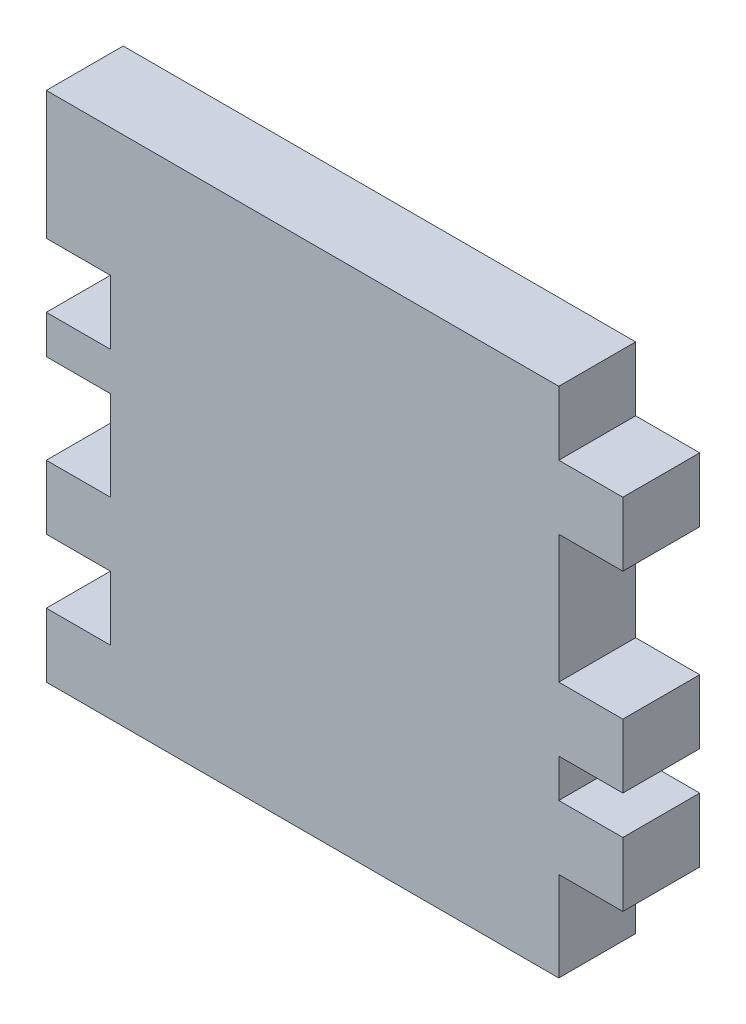
ISO-10303-21;
HEADER;
FILE_DESCRIPTION(('STEP AP214'),'2;1');
FILE_NAME('part.step','',(''),(''),'','','');
FILE_SCHEMA(('AUTOMOTIVE_DESIGN { 1 0 10303 214 1 1 1 1 }'));
ENDSEC;
DATA;
#1=APPLICATION_CONTEXT('core data for automotive mechanical design processes');
#2=APPLICATION_PROTOCOL_DEFINITION('international standard','automotive_design',2000,#1);
#3=PRODUCT_CONTEXT('',#1,'mechanical');
#4=PRODUCT('Part','Part','',(#3));
#5=PRODUCT_RELATED_PRODUCT_CATEGORY('part','',(#4));
#6=PRODUCT_DEFINITION_FORMATION('','',#4);
#7=PRODUCT_DEFINITION_CONTEXT('part definition',#1,'design');
#8=PRODUCT_DEFINITION('design','',#6,#7);
#9=PRODUCT_DEFINITION_SHAPE('','',#8);
#10=(LENGTH_UNIT() NAMED_UNIT(*) SI_UNIT(.MILLI.,.METRE.));
#11=(NAMED_UNIT(*) PLANE_ANGLE_UNIT() SI_UNIT($,.RADIAN.));
#12=(NAMED_UNIT(*) SI_UNIT($,.STERADIAN.) SOLID_ANGLE_UNIT());
#13=UNCERTAINTY_MEASURE_WITH_UNIT(LENGTH_MEASURE(1.E-05),#10,'distance_accuracy_value','');
#14=(GEOMETRIC_REPRESENTATION_CONTEXT(3) GLOBAL_UNCERTAINTY_ASSIGNED_CONTEXT((#13)) GLOBAL_UNIT_ASSIGNED_CONTEXT((#10,
#11,#12)) REPRESENTATION_CONTEXT('',''));
#15=CARTESIAN_POINT('',(0.,0.,0.));
#16=DIRECTION('',(0.,0.,1.));
#17=DIRECTION('',(1.,0.,0.));
#18=AXIS2_PLACEMENT_3D('',#15,#16,#17);
#19=CARTESIAN_POINT('',(23.7388987566607,17.3845470692718,6.));
#20=DIRECTION('',(1.,0.,0.));
#21=DIRECTION('',(0.,1.,0.));
#22=AXIS2_PLACEMENT_3D('',#19,#20,#21);
#23=PLANE('',#22);
#24=DIRECTION('',(0.,-1.,0.));
#25=VECTOR('',#24,1.);
#26=CARTESIAN_POINT('',(23.7388987566607,17.3845470692718,6.));
#27=LINE('',#26,#25);
#28=CARTESIAN_POINT('',(23.7388987566607,-10.6154529307282,6.));
#29=VERTEX_POINT('',#28);
#30=CARTESIAN_POINT('',(23.7388987566607,-15.6154529307282,6.));
#31=VERTEX_POINT('',#30);
#32=EDGE_CURVE('E237',#29,#31,#27,.T.);
#33=ORIENTED_EDGE('',*,*,#32,.T.);
#34=DIRECTION('',(0.,0.,1.));
#35=VECTOR('',#34,1.);
#36=CARTESIAN_POINT('',(23.7388987566607,-15.6154529307282,0.));
#37=LINE('',#36,#35);
#38=CARTESIAN_POINT('',(23.7388987566607,-15.6154529307282,0.));
#39=VERTEX_POINT('',#38);
#40=EDGE_CURVE('E222',#39,#31,#37,.T.);
#41=ORIENTED_EDGE('',*,*,#40,.F.);
#42=DIRECTION('',(0.,-1.,0.));
#43=VECTOR('',#42,1.);
#44=CARTESIAN_POINT('',(23.7388987566607,17.3845470692718,0.));
#45=LINE('',#44,#43);
#46=CARTESIAN_POINT('',(23.7388987566607,-10.6154529307282,0.));
#47=VERTEX_POINT('',#46);
#48=EDGE_CURVE('E235',#47,#39,#45,.T.);
#49=ORIENTED_EDGE('',*,*,#48,.F.);
#50=DIRECTION('',(0.,0.,1.));
#51=VECTOR('',#50,1.);
#52=CARTESIAN_POINT('',(23.7388987566607,-10.6154529307282,0.));
#53=LINE('',#52,#51);
#54=EDGE_CURVE('E391',#47,#29,#53,.T.);
#55=ORIENTED_EDGE('',*,*,#54,.T.);
#56=EDGE_LOOP('',(#33,#41,#49,#55));
#57=FACE_BOUND('',#56,.T.);
#58=ADVANCED_FACE('F33',(#57),#23,.T.);
#59=CARTESIAN_POINT('',(0.,0.,6.));
#60=DIRECTION('',(0.,0.,-1.));
#61=DIRECTION('',(-1.,0.,0.));
#62=AXIS2_PLACEMENT_3D('',#59,#60,#61);
#63=PLANE('',#62);
#64=DIRECTION('',(1.,0.,0.));
#65=VECTOR('',#64,1.);
#66=CARTESIAN_POINT('',(18.7388987566607,-15.6154529307282,6.));
#67=LINE('',#66,#65);
#68=CARTESIAN_POINT('',(18.7388987566607,-15.6154529307282,6.));
#69=VERTEX_POINT('',#68);
#70=EDGE_CURVE('E229',#69,#31,#67,.T.);
#71=ORIENTED_EDGE('',*,*,#70,.T.);
#72=ORIENTED_EDGE('',*,*,#32,.F.);
#73=DIRECTION('',(-1.,0.,0.));
#74=VECTOR('',#73,1.);
#75=CARTESIAN_POINT('',(23.7388987566607,-10.6154529307282,6.));
#76=LINE('',#75,#74);
#77=CARTESIAN_POINT('',(18.7388987566608,-10.6154529307282,6.));
#78=VERTEX_POINT('',#77);
#79=EDGE_CURVE('E392',#29,#78,#76,.T.);
#80=ORIENTED_EDGE('',*,*,#79,.T.);
#81=DIRECTION('',(0.,-1.,0.));
#82=VECTOR('',#81,1.);
#83=CARTESIAN_POINT('',(18.7388987566608,-7.61545293072824,6.));
#84=LINE('',#83,#82);
#85=CARTESIAN_POINT('',(18.7388987566608,-7.61545293072824,6.));
#86=VERTEX_POINT('',#85);
#87=EDGE_CURVE('E396',#86,#78,#84,.T.);
#88=ORIENTED_EDGE('',*,*,#87,.F.);
#89=DIRECTION('',(-1.,0.,0.));
#90=VECTOR('',#89,1.);
#91=CARTESIAN_POINT('',(23.7388987566607,-7.61545293072824,6.));
#92=LINE('',#91,#90);
#93=CARTESIAN_POINT('',(23.7388987566607,-7.61545293072824,6.));
#94=VERTEX_POINT('',#93);
#95=EDGE_CURVE('E385',#94,#86,#92,.T.);
#96=ORIENTED_EDGE('',*,*,#95,.F.);
#97=CARTESIAN_POINT('',(23.7388987566607,-2.61545293072824,6.));
#98=VERTEX_POINT('',#97);
#99=EDGE_CURVE('E296',#98,#94,#27,.T.);
#100=ORIENTED_EDGE('',*,*,#99,.F.);
#101=DIRECTION('',(-1.,0.,0.));
#102=VECTOR('',#101,1.);
#103=CARTESIAN_POINT('',(23.7388987566607,-2.61545293072824,6.));
#104=LINE('',#103,#102);
#105=CARTESIAN_POINT('',(18.7388987566608,-2.61545293072824,6.));
#106=VERTEX_POINT('',#105);
#107=EDGE_CURVE('E414',#98,#106,#104,.T.);
#108=ORIENTED_EDGE('',*,*,#107,.T.);
#109=DIRECTION('',(0.,-1.,0.));
#110=VECTOR('',#109,1.);
#111=CARTESIAN_POINT('',(18.7388987566608,7.38454706927176,6.));
#112=LINE('',#111,#110);
#113=CARTESIAN_POINT('',(18.7388987566608,7.38454706927176,6.));
#114=VERTEX_POINT('',#113);
#115=EDGE_CURVE('E418',#114,#106,#112,.T.);
#116=ORIENTED_EDGE('',*,*,#115,.F.);
#117=DIRECTION('',(-1.,0.,0.));
#118=VECTOR('',#117,1.);
#119=CARTESIAN_POINT('',(23.7388987566607,7.38454706927176,6.));
#120=LINE('',#119,#118);
#121=CARTESIAN_POINT('',(23.7388987566607,7.38454706927176,6.));
#122=VERTEX_POINT('',#121);
#123=EDGE_CURVE('E409',#122,#114,#120,.T.);
#124=ORIENTED_EDGE('',*,*,#123,.F.);
#125=CARTESIAN_POINT('',(23.7388987566607,12.3845470692718,6.));
#126=VERTEX_POINT('',#125);
#127=EDGE_CURVE('E292',#126,#122,#27,.T.);
#128=ORIENTED_EDGE('',*,*,#127,.F.);
#129=DIRECTION('',(-1.,0.,0.));
#130=VECTOR('',#129,1.);
#131=CARTESIAN_POINT('',(23.7388987566607,12.3845470692718,6.));
#132=LINE('',#131,#130);
#133=CARTESIAN_POINT('',(18.7388987566607,12.3845470692718,6.));
#134=VERTEX_POINT('',#133);
#135=EDGE_CURVE('E436',#126,#134,#132,.T.);
#136=ORIENTED_EDGE('',*,*,#135,.T.);
#137=DIRECTION('',(0.,1.,0.));
#138=VECTOR('',#137,1.);
#139=CARTESIAN_POINT('',(18.7388987566607,12.3845470692718,6.));
#140=LINE('',#139,#138);
#141=CARTESIAN_POINT('',(18.7388987566607,17.3845470692718,6.));
#142=VERTEX_POINT('',#141);
#143=EDGE_CURVE('E417',#134,#142,#140,.T.);
#144=ORIENTED_EDGE('',*,*,#143,.T.);
#145=DIRECTION('',(1.,0.,0.));
#146=VECTOR('',#145,1.);
#147=CARTESIAN_POINT('',(-21.2611012433392,17.3845470692718,6.));
#148=LINE('',#147,#146);
#149=CARTESIAN_POINT('',(-21.2611012433392,17.3845470692718,6.));
#150=VERTEX_POINT('',#149);
#151=EDGE_CURVE('E286',#150,#142,#148,.T.);
#152=ORIENTED_EDGE('',*,*,#151,.F.);
#153=DIRECTION('',(0.,-1.,0.));
#154=VECTOR('',#153,1.);
#155=CARTESIAN_POINT('',(-21.2611012433392,17.3845470692718,6.));
#156=LINE('',#155,#154);
#157=CARTESIAN_POINT('',(-21.2611012433392,7.38454706927176,6.));
#158=VERTEX_POINT('',#157);
#159=EDGE_CURVE('E270',#150,#158,#156,.T.);
#160=ORIENTED_EDGE('',*,*,#159,.T.);
#161=DIRECTION('',(1.,0.,0.));
#162=VECTOR('',#161,1.);
#163=CARTESIAN_POINT('',(-21.2611012433392,7.38454706927176,6.));
#164=LINE('',#163,#162);
#165=CARTESIAN_POINT('',(-16.2611012433392,7.38454706927176,6.));
#166=VERTEX_POINT('',#165);
#167=EDGE_CURVE('E363',#158,#166,#164,.T.);
#168=ORIENTED_EDGE('',*,*,#167,.T.);
#169=DIRECTION('',(0.,-1.,0.));
#170=VECTOR('',#169,1.);
#171=CARTESIAN_POINT('',(-16.2611012433392,7.38454706927176,6.));
#172=LINE('',#171,#170);
#173=CARTESIAN_POINT('',(-16.2611012433392,2.38454706927176,6.));
#174=VERTEX_POINT('',#173);
#175=EDGE_CURVE('E366',#166,#174,#172,.T.);
#176=ORIENTED_EDGE('',*,*,#175,.T.);
#177=DIRECTION('',(1.,0.,0.));
#178=VECTOR('',#177,1.);
#179=CARTESIAN_POINT('',(-21.2611012433392,2.38454706927176,6.));
#180=LINE('',#179,#178);
#181=CARTESIAN_POINT('',(-21.2611012433392,2.38454706927176,6.));
#182=VERTEX_POINT('',#181);
#183=EDGE_CURVE('E341',#182,#174,#180,.T.);
#184=ORIENTED_EDGE('',*,*,#183,.F.);
#185=CARTESIAN_POINT('',(-21.2611012433392,-0.615452930728243,6.));
#186=VERTEX_POINT('',#185);
#187=EDGE_CURVE('E276',#182,#186,#156,.T.);
#188=ORIENTED_EDGE('',*,*,#187,.T.);
#189=DIRECTION('',(1.,0.,0.));
#190=VECTOR('',#189,1.);
#191=CARTESIAN_POINT('',(-21.2611012433392,-0.615452930728243,6.));
#192=LINE('',#191,#190);
#193=CARTESIAN_POINT('',(-16.2611012433392,-0.615452930728241,6.));
#194=VERTEX_POINT('',#193);
#195=EDGE_CURVE('E331',#186,#194,#192,.T.);
#196=ORIENTED_EDGE('',*,*,#195,.T.);
#197=DIRECTION('',(0.,-1.,0.));
#198=VECTOR('',#197,1.);
#199=CARTESIAN_POINT('',(-16.2611012433392,-0.615452930728241,6.));
#200=LINE('',#199,#198);
#201=CARTESIAN_POINT('',(-16.2611012433392,-7.61545293072824,6.));
#202=VERTEX_POINT('',#201);
#203=EDGE_CURVE('E342',#194,#202,#200,.T.);
#204=ORIENTED_EDGE('',*,*,#203,.T.);
#205=DIRECTION('',(1.,0.,0.));
#206=VECTOR('',#205,1.);
#207=CARTESIAN_POINT('',(-21.2611012433392,-7.61545293072824,6.));
#208=LINE('',#207,#206);
#209=CARTESIAN_POINT('',(-21.2611012433392,-7.61545293072824,6.));
#210=VERTEX_POINT('',#209);
#211=EDGE_CURVE('E338',#210,#202,#208,.T.);
#212=ORIENTED_EDGE('',*,*,#211,.F.);
#213=CARTESIAN_POINT('',(-21.2611012433392,-12.6154529307282,6.));
#214=VERTEX_POINT('',#213);
#215=EDGE_CURVE('E284',#210,#214,#156,.T.);
#216=ORIENTED_EDGE('',*,*,#215,.T.);
#217=DIRECTION('',(1.,0.,0.));
#218=VECTOR('',#217,1.);
#219=CARTESIAN_POINT('',(-21.2611012433392,-12.6154529307282,6.));
#220=LINE('',#219,#218);
#221=CARTESIAN_POINT('',(-16.2611012433393,-12.6154529307282,6.));
#222=VERTEX_POINT('',#221);
#223=EDGE_CURVE('E303',#214,#222,#220,.T.);
#224=ORIENTED_EDGE('',*,*,#223,.T.);
#225=DIRECTION('',(0.,-1.,0.));
#226=VECTOR('',#225,1.);
#227=CARTESIAN_POINT('',(-16.2611012433393,-12.6154529307282,6.));
#228=LINE('',#227,#226);
#229=CARTESIAN_POINT('',(-16.2611012433392,-17.6154529307282,6.));
#230=VERTEX_POINT('',#229);
#231=EDGE_CURVE('E314',#222,#230,#228,.T.);
#232=ORIENTED_EDGE('',*,*,#231,.T.);
#233=DIRECTION('',(1.,0.,0.));
#234=VECTOR('',#233,1.);
#235=CARTESIAN_POINT('',(-21.2611012433392,-17.6154529307282,6.));
#236=LINE('',#235,#234);
#237=CARTESIAN_POINT('',(-21.2611012433392,-17.6154529307282,6.));
#238=VERTEX_POINT('',#237);
#239=EDGE_CURVE('E310',#238,#230,#236,.T.);
#240=ORIENTED_EDGE('',*,*,#239,.F.);
#241=CARTESIAN_POINT('',(-21.2611012433392,-22.6154529307282,6.));
#242=VERTEX_POINT('',#241);
#243=EDGE_CURVE('E278',#238,#242,#156,.T.);
#244=ORIENTED_EDGE('',*,*,#243,.T.);
#245=DIRECTION('',(1.,0.,0.));
#246=VECTOR('',#245,1.);
#247=CARTESIAN_POINT('',(-21.2611012433392,-22.6154529307282,6.));
#248=LINE('',#247,#246);
#249=CARTESIAN_POINT('',(18.7388987566607,-22.6154529307282,6.));
#250=VERTEX_POINT('',#249);
#251=EDGE_CURVE('E267',#242,#250,#248,.T.);
#252=ORIENTED_EDGE('',*,*,#251,.T.);
#253=DIRECTION('',(0.,-1.,0.));
#254=VECTOR('',#253,1.);
#255=CARTESIAN_POINT('',(18.7388987566607,-17.6154529307282,6.));
#256=LINE('',#255,#254);
#257=EDGE_CURVE('E379',#69,#250,#256,.T.);
#258=ORIENTED_EDGE('',*,*,#257,.F.);
#259=EDGE_LOOP('',(#71,#72,#80,#88,#96,#100,#108,#116,#124,#128,#136,#144,#152,#160,#168,#176,
#184,#188,#196,#204,#212,#216,#224,#232,#240,#244,#252,#258));
#260=FACE_BOUND('',#259,.T.);
#261=ADVANCED_FACE('F445',(#260),#63,.F.);
#262=CARTESIAN_POINT('',(0.,0.,0.));
#263=DIRECTION('',(0.,0.,-1.));
#264=DIRECTION('',(-1.,0.,0.));
#265=AXIS2_PLACEMENT_3D('',#262,#263,#264);
#266=PLANE('',#265);
#267=ORIENTED_EDGE('',*,*,#48,.T.);
#268=DIRECTION('',(1.,0.,0.));
#269=VECTOR('',#268,1.);
#270=CARTESIAN_POINT('',(18.7388987566607,-15.6154529307282,0.));
#271=LINE('',#270,#269);
#272=CARTESIAN_POINT('',(18.7388987566607,-15.6154529307282,0.));
#273=VERTEX_POINT('',#272);
#274=EDGE_CURVE('E218',#273,#39,#271,.T.);
#275=ORIENTED_EDGE('',*,*,#274,.F.);
#276=DIRECTION('',(0.,-1.,0.));
#277=VECTOR('',#276,1.);
#278=CARTESIAN_POINT('',(18.7388987566607,-17.6154529307282,0.));
#279=LINE('',#278,#277);
#280=CARTESIAN_POINT('',(18.7388987566607,-22.6154529307282,0.));
#281=VERTEX_POINT('',#280);
#282=EDGE_CURVE('E377',#273,#281,#279,.T.);
#283=ORIENTED_EDGE('',*,*,#282,.T.);
#284=DIRECTION('',(1.,0.,0.));
#285=VECTOR('',#284,1.);
#286=CARTESIAN_POINT('',(-21.2611012433392,-22.6154529307282,0.));
#287=LINE('',#286,#285);
#288=CARTESIAN_POINT('',(-21.2611012433392,-22.6154529307282,0.));
#289=VERTEX_POINT('',#288);
#290=EDGE_CURVE('E245',#289,#281,#287,.T.);
#291=ORIENTED_EDGE('',*,*,#290,.F.);
#292=DIRECTION('',(0.,-1.,0.));
#293=VECTOR('',#292,1.);
#294=CARTESIAN_POINT('',(-21.2611012433392,17.3845470692718,0.));
#295=LINE('',#294,#293);
#296=CARTESIAN_POINT('',(-21.2611012433392,-17.6154529307282,0.));
#297=VERTEX_POINT('',#296);
#298=EDGE_CURVE('E259',#297,#289,#295,.T.);
#299=ORIENTED_EDGE('',*,*,#298,.F.);
#300=DIRECTION('',(1.,0.,0.));
#301=VECTOR('',#300,1.);
#302=CARTESIAN_POINT('',(-21.2611012433392,-17.6154529307282,0.));
#303=LINE('',#302,#301);
#304=CARTESIAN_POINT('',(-16.2611012433392,-17.6154529307282,0.));
#305=VERTEX_POINT('',#304);
#306=EDGE_CURVE('E300',#297,#305,#303,.T.);
#307=ORIENTED_EDGE('',*,*,#306,.T.);
#308=DIRECTION('',(0.,-1.,0.));
#309=VECTOR('',#308,1.);
#310=CARTESIAN_POINT('',(-16.2611012433393,-12.6154529307282,0.));
#311=LINE('',#310,#309);
#312=CARTESIAN_POINT('',(-16.2611012433393,-12.6154529307282,0.));
#313=VERTEX_POINT('',#312);
#314=EDGE_CURVE('E304',#313,#305,#311,.T.);
#315=ORIENTED_EDGE('',*,*,#314,.F.);
#316=DIRECTION('',(1.,0.,0.));
#317=VECTOR('',#316,1.);
#318=CARTESIAN_POINT('',(-21.2611012433392,-12.6154529307282,0.));
#319=LINE('',#318,#317);
#320=CARTESIAN_POINT('',(-21.2611012433392,-12.6154529307282,0.));
#321=VERTEX_POINT('',#320);
#322=EDGE_CURVE('E306',#321,#313,#319,.T.);
#323=ORIENTED_EDGE('',*,*,#322,.F.);
#324=CARTESIAN_POINT('',(-21.2611012433392,-7.61545293072824,0.));
#325=VERTEX_POINT('',#324);
#326=EDGE_CURVE('E263',#325,#321,#295,.T.);
#327=ORIENTED_EDGE('',*,*,#326,.F.);
#328=DIRECTION('',(1.,0.,0.));
#329=VECTOR('',#328,1.);
#330=CARTESIAN_POINT('',(-21.2611012433392,-7.61545293072824,0.));
#331=LINE('',#330,#329);
#332=CARTESIAN_POINT('',(-16.2611012433392,-7.61545293072824,0.));
#333=VERTEX_POINT('',#332);
#334=EDGE_CURVE('E328',#325,#333,#331,.T.);
#335=ORIENTED_EDGE('',*,*,#334,.T.);
#336=DIRECTION('',(0.,-1.,0.));
#337=VECTOR('',#336,1.);
#338=CARTESIAN_POINT('',(-16.2611012433392,-0.615452930728241,0.));
#339=LINE('',#338,#337);
#340=CARTESIAN_POINT('',(-16.2611012433392,-0.615452930728241,0.));
#341=VERTEX_POINT('',#340);
#342=EDGE_CURVE('E332',#341,#333,#339,.T.);
#343=ORIENTED_EDGE('',*,*,#342,.F.);
#344=DIRECTION('',(1.,0.,0.));
#345=VECTOR('',#344,1.);
#346=CARTESIAN_POINT('',(-21.2611012433392,-0.615452930728243,0.));
#347=LINE('',#346,#345);
#348=CARTESIAN_POINT('',(-21.2611012433392,-0.615452930728243,0.));
#349=VERTEX_POINT('',#348);
#350=EDGE_CURVE('E334',#349,#341,#347,.T.);
#351=ORIENTED_EDGE('',*,*,#350,.F.);
#352=CARTESIAN_POINT('',(-21.2611012433392,2.38454706927176,0.));
#353=VERTEX_POINT('',#352);
#354=EDGE_CURVE('E268',#353,#349,#295,.T.);
#355=ORIENTED_EDGE('',*,*,#354,.F.);
#356=DIRECTION('',(1.,0.,0.));
#357=VECTOR('',#356,1.);
#358=CARTESIAN_POINT('',(-21.2611012433392,2.38454706927176,0.));
#359=LINE('',#358,#357);
#360=CARTESIAN_POINT('',(-16.2611012433392,2.38454706927176,0.));
#361=VERTEX_POINT('',#360);
#362=EDGE_CURVE('E365',#353,#361,#359,.T.);
#363=ORIENTED_EDGE('',*,*,#362,.T.);
#364=DIRECTION('',(0.,-1.,0.));
#365=VECTOR('',#364,1.);
#366=CARTESIAN_POINT('',(-16.2611012433392,7.38454706927176,0.));
#367=LINE('',#366,#365);
#368=CARTESIAN_POINT('',(-16.2611012433392,7.38454706927176,0.));
#369=VERTEX_POINT('',#368);
#370=EDGE_CURVE('E373',#369,#361,#367,.T.);
#371=ORIENTED_EDGE('',*,*,#370,.F.);
#372=DIRECTION('',(1.,0.,0.));
#373=VECTOR('',#372,1.);
#374=CARTESIAN_POINT('',(-21.2611012433392,7.38454706927176,0.));
#375=LINE('',#374,#373);
#376=CARTESIAN_POINT('',(-21.2611012433392,7.38454706927176,0.));
#377=VERTEX_POINT('',#376);
#378=EDGE_CURVE('E357',#377,#369,#375,.T.);
#379=ORIENTED_EDGE('',*,*,#378,.F.);
#380=CARTESIAN_POINT('',(-21.2611012433392,17.3845470692718,0.));
#381=VERTEX_POINT('',#380);
#382=EDGE_CURVE('E265',#381,#377,#295,.T.);
#383=ORIENTED_EDGE('',*,*,#382,.F.);
#384=DIRECTION('',(1.,0.,0.));
#385=VECTOR('',#384,1.);
#386=CARTESIAN_POINT('',(-21.2611012433392,17.3845470692718,0.));
#387=LINE('',#386,#385);
#388=CARTESIAN_POINT('',(18.7388987566607,17.3845470692718,0.));
#389=VERTEX_POINT('',#388);
#390=EDGE_CURVE('E254',#381,#389,#387,.T.);
#391=ORIENTED_EDGE('',*,*,#390,.T.);
#392=DIRECTION('',(0.,1.,0.));
#393=VECTOR('',#392,1.);
#394=CARTESIAN_POINT('',(18.7388987566607,12.3845470692718,0.));
#395=LINE('',#394,#393);
#396=CARTESIAN_POINT('',(18.7388987566607,12.3845470692718,0.));
#397=VERTEX_POINT('',#396);
#398=EDGE_CURVE('E439',#397,#389,#395,.T.);
#399=ORIENTED_EDGE('',*,*,#398,.F.);
#400=DIRECTION('',(-1.,0.,0.));
#401=VECTOR('',#400,1.);
#402=CARTESIAN_POINT('',(23.7388987566607,12.3845470692718,0.));
#403=LINE('',#402,#401);
#404=CARTESIAN_POINT('',(23.7388987566607,12.3845470692718,0.));
#405=VERTEX_POINT('',#404);
#406=EDGE_CURVE('E432',#405,#397,#403,.T.);
#407=ORIENTED_EDGE('',*,*,#406,.F.);
#408=CARTESIAN_POINT('',(23.7388987566607,7.38454706927176,0.));
#409=VERTEX_POINT('',#408);
#410=EDGE_CURVE('E247',#405,#409,#45,.T.);
#411=ORIENTED_EDGE('',*,*,#410,.T.);
#412=DIRECTION('',(-1.,0.,0.));
#413=VECTOR('',#412,1.);
#414=CARTESIAN_POINT('',(23.7388987566607,7.38454706927176,0.));
#415=LINE('',#414,#413);
#416=CARTESIAN_POINT('',(18.7388987566608,7.38454706927176,0.));
#417=VERTEX_POINT('',#416);
#418=EDGE_CURVE('E411',#409,#417,#415,.T.);
#419=ORIENTED_EDGE('',*,*,#418,.T.);
#420=DIRECTION('',(0.,-1.,0.));
#421=VECTOR('',#420,1.);
#422=CARTESIAN_POINT('',(18.7388987566608,7.38454706927176,0.));
#423=LINE('',#422,#421);
#424=CARTESIAN_POINT('',(18.7388987566608,-2.61545293072824,0.));
#425=VERTEX_POINT('',#424);
#426=EDGE_CURVE('E56',#417,#425,#423,.T.);
#427=ORIENTED_EDGE('',*,*,#426,.T.);
#428=DIRECTION('',(-1.,0.,0.));
#429=VECTOR('',#428,1.);
#430=CARTESIAN_POINT('',(23.7388987566607,-2.61545293072824,0.));
#431=LINE('',#430,#429);
#432=CARTESIAN_POINT('',(23.7388987566607,-2.61545293072824,0.));
#433=VERTEX_POINT('',#432);
#434=EDGE_CURVE('E407',#433,#425,#431,.T.);
#435=ORIENTED_EDGE('',*,*,#434,.F.);
#436=CARTESIAN_POINT('',(23.7388987566607,-7.61545293072824,0.));
#437=VERTEX_POINT('',#436);
#438=EDGE_CURVE('E244',#433,#437,#45,.T.);
#439=ORIENTED_EDGE('',*,*,#438,.T.);
#440=DIRECTION('',(-1.,0.,0.));
#441=VECTOR('',#440,1.);
#442=CARTESIAN_POINT('',(23.7388987566607,-7.61545293072824,0.));
#443=LINE('',#442,#441);
#444=CARTESIAN_POINT('',(18.7388987566608,-7.61545293072824,0.));
#445=VERTEX_POINT('',#444);
#446=EDGE_CURVE('E388',#437,#445,#443,.T.);
#447=ORIENTED_EDGE('',*,*,#446,.T.);
#448=DIRECTION('',(0.,-1.,0.));
#449=VECTOR('',#448,1.);
#450=CARTESIAN_POINT('',(18.7388987566608,-7.61545293072824,0.));
#451=LINE('',#450,#449);
#452=CARTESIAN_POINT('',(18.7388987566608,-10.6154529307282,0.));
#453=VERTEX_POINT('',#452);
#454=EDGE_CURVE('E386',#445,#453,#451,.T.);
#455=ORIENTED_EDGE('',*,*,#454,.T.);
#456=DIRECTION('',(-1.,0.,0.));
#457=VECTOR('',#456,1.);
#458=CARTESIAN_POINT('',(23.7388987566607,-10.6154529307282,0.));
#459=LINE('',#458,#457);
#460=EDGE_CURVE('E243',#47,#453,#459,.T.);
#461=ORIENTED_EDGE('',*,*,#460,.F.);
#462=EDGE_LOOP('',(#267,#275,#283,#291,#299,#307,#315,#323,#327,#335,#343,#351,#355,#363,#371,
#379,#383,#391,#399,#407,#411,#419,#427,#435,#439,#447,#455,#461));
#463=FACE_BOUND('',#462,.T.);
#464=ADVANCED_FACE('F241',(#463),#266,.T.);
#465=ORIENTED_EDGE('',*,*,#410,.F.);
#466=DIRECTION('',(0.,0.,1.));
#467=VECTOR('',#466,1.);
#468=CARTESIAN_POINT('',(23.7388987566607,12.3845470692718,0.));
#469=LINE('',#468,#467);
#470=EDGE_CURVE('E322',#405,#126,#469,.T.);
#471=ORIENTED_EDGE('',*,*,#470,.T.);
#472=ORIENTED_EDGE('',*,*,#127,.T.);
#473=DIRECTION('',(0.,0.,1.));
#474=VECTOR('',#473,1.);
#475=CARTESIAN_POINT('',(23.7388987566607,7.38454706927176,0.));
#476=LINE('',#475,#474);
#477=EDGE_CURVE('E425',#409,#122,#476,.T.);
#478=ORIENTED_EDGE('',*,*,#477,.F.);
#479=EDGE_LOOP('',(#465,#471,#472,#478));
#480=FACE_BOUND('',#479,.T.);
#481=ADVANCED_FACE('F464',(#480),#23,.T.);
#482=ORIENTED_EDGE('',*,*,#438,.F.);
#483=DIRECTION('',(0.,0.,1.));
#484=VECTOR('',#483,1.);
#485=CARTESIAN_POINT('',(23.7388987566607,-2.61545293072824,0.));
#486=LINE('',#485,#484);
#487=EDGE_CURVE('E413',#433,#98,#486,.T.);
#488=ORIENTED_EDGE('',*,*,#487,.T.);
#489=ORIENTED_EDGE('',*,*,#99,.T.);
#490=DIRECTION('',(0.,0.,1.));
#491=VECTOR('',#490,1.);
#492=CARTESIAN_POINT('',(23.7388987566607,-7.61545293072824,0.));
#493=LINE('',#492,#491);
#494=EDGE_CURVE('E402',#437,#94,#493,.T.);
#495=ORIENTED_EDGE('',*,*,#494,.F.);
#496=EDGE_LOOP('',(#482,#488,#489,#495));
#497=FACE_BOUND('',#496,.T.);
#498=ADVANCED_FACE('F463',(#497),#23,.T.);
#499=CARTESIAN_POINT('',(-21.2611012433392,17.3845470692718,6.));
#500=DIRECTION('',(0.,1.,0.));
#501=DIRECTION('',(0.,0.,1.));
#502=AXIS2_PLACEMENT_3D('',#499,#500,#501);
#503=PLANE('',#502);
#504=ORIENTED_EDGE('',*,*,#151,.T.);
#505=DIRECTION('',(0.,0.,1.));
#506=VECTOR('',#505,1.);
#507=CARTESIAN_POINT('',(18.7388987566607,17.3845470692718,0.));
#508=LINE('',#507,#506);
#509=EDGE_CURVE('E430',#389,#142,#508,.T.);
#510=ORIENTED_EDGE('',*,*,#509,.F.);
#511=ORIENTED_EDGE('',*,*,#390,.F.);
#512=DIRECTION('',(0.,0.,-1.));
#513=VECTOR('',#512,1.);
#514=CARTESIAN_POINT('',(-21.2611012433392,17.3845470692718,6.));
#515=LINE('',#514,#513);
#516=EDGE_CURVE('E11',#150,#381,#515,.T.);
#517=ORIENTED_EDGE('',*,*,#516,.F.);
#518=EDGE_LOOP('',(#504,#510,#511,#517));
#519=FACE_BOUND('',#518,.T.);
#520=ADVANCED_FACE('F471',(#519),#503,.T.);
#521=CARTESIAN_POINT('',(-21.2611012433392,17.3845470692718,6.));
#522=DIRECTION('',(1.,0.,0.));
#523=DIRECTION('',(0.,1.,0.));
#524=AXIS2_PLACEMENT_3D('',#521,#522,#523);
#525=PLANE('',#524);
#526=DIRECTION('',(0.,0.,1.));
#527=VECTOR('',#526,1.);
#528=CARTESIAN_POINT('',(-21.2611012433392,7.38454706927176,0.));
#529=LINE('',#528,#527);
#530=EDGE_CURVE('E359',#377,#158,#529,.T.);
#531=ORIENTED_EDGE('',*,*,#530,.T.);
#532=ORIENTED_EDGE('',*,*,#159,.F.);
#533=ORIENTED_EDGE('',*,*,#516,.T.);
#534=ORIENTED_EDGE('',*,*,#382,.T.);
#535=EDGE_LOOP('',(#531,#532,#533,#534));
#536=FACE_BOUND('',#535,.T.);
#537=ADVANCED_FACE('F459',(#536),#525,.F.);
#538=ORIENTED_EDGE('',*,*,#187,.F.);
#539=DIRECTION('',(0.,0.,1.));
#540=VECTOR('',#539,1.);
#541=CARTESIAN_POINT('',(-21.2611012433392,2.38454706927176,0.));
#542=LINE('',#541,#540);
#543=EDGE_CURVE('E250',#353,#182,#542,.T.);
#544=ORIENTED_EDGE('',*,*,#543,.F.);
#545=ORIENTED_EDGE('',*,*,#354,.T.);
#546=DIRECTION('',(0.,0.,1.));
#547=VECTOR('',#546,1.);
#548=CARTESIAN_POINT('',(-21.2611012433392,-0.615452930728243,0.));
#549=LINE('',#548,#547);
#550=EDGE_CURVE('E348',#349,#186,#549,.T.);
#551=ORIENTED_EDGE('',*,*,#550,.T.);
#552=EDGE_LOOP('',(#538,#544,#545,#551));
#553=FACE_BOUND('',#552,.T.);
#554=ADVANCED_FACE('F460',(#553),#525,.F.);
#555=ORIENTED_EDGE('',*,*,#215,.F.);
#556=DIRECTION('',(0.,0.,1.));
#557=VECTOR('',#556,1.);
#558=CARTESIAN_POINT('',(-21.2611012433392,-7.61545293072824,0.));
#559=LINE('',#558,#557);
#560=EDGE_CURVE('E313',#325,#210,#559,.T.);
#561=ORIENTED_EDGE('',*,*,#560,.F.);
#562=ORIENTED_EDGE('',*,*,#326,.T.);
#563=DIRECTION('',(0.,0.,1.));
#564=VECTOR('',#563,1.);
#565=CARTESIAN_POINT('',(-21.2611012433392,-12.6154529307282,0.));
#566=LINE('',#565,#564);
#567=EDGE_CURVE('E321',#321,#214,#566,.T.);
#568=ORIENTED_EDGE('',*,*,#567,.T.);
#569=EDGE_LOOP('',(#555,#561,#562,#568));
#570=FACE_BOUND('',#569,.T.);
#571=ADVANCED_FACE('F451',(#570),#525,.F.);
#572=CARTESIAN_POINT('',(-21.2611012433392,-22.6154529307282,6.));
#573=DIRECTION('',(0.,1.,0.));
#574=DIRECTION('',(0.,0.,1.));
#575=AXIS2_PLACEMENT_3D('',#572,#573,#574);
#576=PLANE('',#575);
#577=ORIENTED_EDGE('',*,*,#290,.T.);
#578=DIRECTION('',(0.,0.,1.));
#579=VECTOR('',#578,1.);
#580=CARTESIAN_POINT('',(18.7388987566607,-22.6154529307282,0.));
#581=LINE('',#580,#579);
#582=EDGE_CURVE('E238',#281,#250,#581,.T.);
#583=ORIENTED_EDGE('',*,*,#582,.T.);
#584=ORIENTED_EDGE('',*,*,#251,.F.);
#585=DIRECTION('',(0.,0.,-1.));
#586=VECTOR('',#585,1.);
#587=CARTESIAN_POINT('',(-21.2611012433392,-22.6154529307282,6.));
#588=LINE('',#587,#586);
#589=EDGE_CURVE('E41',#242,#289,#588,.T.);
#590=ORIENTED_EDGE('',*,*,#589,.T.);
#591=EDGE_LOOP('',(#577,#583,#584,#590));
#592=FACE_BOUND('',#591,.T.);
#593=ADVANCED_FACE('F35',(#592),#576,.F.);
#594=ORIENTED_EDGE('',*,*,#243,.F.);
#595=DIRECTION('',(0.,0.,1.));
#596=VECTOR('',#595,1.);
#597=CARTESIAN_POINT('',(-21.2611012433392,-17.6154529307282,0.));
#598=LINE('',#597,#596);
#599=EDGE_CURVE('E319',#297,#238,#598,.T.);
#600=ORIENTED_EDGE('',*,*,#599,.F.);
#601=ORIENTED_EDGE('',*,*,#298,.T.);
#602=ORIENTED_EDGE('',*,*,#589,.F.);
#603=EDGE_LOOP('',(#594,#600,#601,#602));
#604=FACE_BOUND('',#603,.T.);
#605=ADVANCED_FACE('F450',(#604),#525,.F.);
#606=CARTESIAN_POINT('',(-21.2611012433392,-17.6154529307282,0.));
#607=DIRECTION('',(0.,-1.,0.));
#608=DIRECTION('',(0.,0.,-1.));
#609=AXIS2_PLACEMENT_3D('',#606,#607,#608);
#610=PLANE('',#609);
#611=ORIENTED_EDGE('',*,*,#239,.T.);
#612=DIRECTION('',(0.,0.,1.));
#613=VECTOR('',#612,1.);
#614=CARTESIAN_POINT('',(-16.2611012433392,-17.6154529307282,0.));
#615=LINE('',#614,#613);
#616=EDGE_CURVE('E309',#305,#230,#615,.T.);
#617=ORIENTED_EDGE('',*,*,#616,.F.);
#618=ORIENTED_EDGE('',*,*,#306,.F.);
#619=ORIENTED_EDGE('',*,*,#599,.T.);
#620=EDGE_LOOP('',(#611,#617,#618,#619));
#621=FACE_BOUND('',#620,.T.);
#622=ADVANCED_FACE('F456',(#621),#610,.F.);
#623=CARTESIAN_POINT('',(-21.2611012433392,-12.6154529307282,0.));
#624=DIRECTION('',(0.,-1.,0.));
#625=DIRECTION('',(0.,0.,-1.));
#626=AXIS2_PLACEMENT_3D('',#623,#624,#625);
#627=PLANE('',#626);
#628=ORIENTED_EDGE('',*,*,#223,.F.);
#629=ORIENTED_EDGE('',*,*,#567,.F.);
#630=ORIENTED_EDGE('',*,*,#322,.T.);
#631=DIRECTION('',(0.,0.,1.));
#632=VECTOR('',#631,1.);
#633=CARTESIAN_POINT('',(-16.2611012433393,-12.6154529307282,0.));
#634=LINE('',#633,#632);
#635=EDGE_CURVE('E325',#313,#222,#634,.T.);
#636=ORIENTED_EDGE('',*,*,#635,.T.);
#637=EDGE_LOOP('',(#628,#629,#630,#636));
#638=FACE_BOUND('',#637,.T.);
#639=ADVANCED_FACE('F543',(#638),#627,.T.);
#640=CARTESIAN_POINT('',(-16.2611012433393,-12.6154529307282,0.));
#641=DIRECTION('',(-1.,0.,0.));
#642=DIRECTION('',(0.,-1.,0.));
#643=AXIS2_PLACEMENT_3D('',#640,#641,#642);
#644=PLANE('',#643);
#645=ORIENTED_EDGE('',*,*,#231,.F.);
#646=ORIENTED_EDGE('',*,*,#635,.F.);
#647=ORIENTED_EDGE('',*,*,#314,.T.);
#648=ORIENTED_EDGE('',*,*,#616,.T.);
#649=EDGE_LOOP('',(#645,#646,#647,#648));
#650=FACE_BOUND('',#649,.T.);
#651=ADVANCED_FACE('F533',(#650),#644,.T.);
#652=CARTESIAN_POINT('',(-21.2611012433392,-7.61545293072824,0.));
#653=DIRECTION('',(0.,-1.,0.));
#654=DIRECTION('',(0.,0.,-1.));
#655=AXIS2_PLACEMENT_3D('',#652,#653,#654);
#656=PLANE('',#655);
#657=ORIENTED_EDGE('',*,*,#211,.T.);
#658=DIRECTION('',(0.,0.,1.));
#659=VECTOR('',#658,1.);
#660=CARTESIAN_POINT('',(-16.2611012433392,-7.61545293072824,0.));
#661=LINE('',#660,#659);
#662=EDGE_CURVE('E337',#333,#202,#661,.T.);
#663=ORIENTED_EDGE('',*,*,#662,.F.);
#664=ORIENTED_EDGE('',*,*,#334,.F.);
#665=ORIENTED_EDGE('',*,*,#560,.T.);
#666=EDGE_LOOP('',(#657,#663,#664,#665));
#667=FACE_BOUND('',#666,.T.);
#668=ADVANCED_FACE('F529',(#667),#656,.F.);
#669=CARTESIAN_POINT('',(-21.2611012433392,-0.615452930728243,0.));
#670=DIRECTION('',(0.,-1.,0.));
#671=DIRECTION('',(1.,0.,0.));
#672=AXIS2_PLACEMENT_3D('',#669,#670,#671);
#673=PLANE('',#672);
#674=ORIENTED_EDGE('',*,*,#195,.F.);
#675=ORIENTED_EDGE('',*,*,#550,.F.);
#676=ORIENTED_EDGE('',*,*,#350,.T.);
#677=DIRECTION('',(0.,0.,1.));
#678=VECTOR('',#677,1.);
#679=CARTESIAN_POINT('',(-16.2611012433392,-0.615452930728241,0.));
#680=LINE('',#679,#678);
#681=EDGE_CURVE('E351',#341,#194,#680,.T.);
#682=ORIENTED_EDGE('',*,*,#681,.T.);
#683=EDGE_LOOP('',(#674,#675,#676,#682));
#684=FACE_BOUND('',#683,.T.);
#685=ADVANCED_FACE('F532',(#684),#673,.T.);
#686=CARTESIAN_POINT('',(-16.2611012433392,-0.615452930728241,0.));
#687=DIRECTION('',(-1.,0.,0.));
#688=DIRECTION('',(0.,0.,1.));
#689=AXIS2_PLACEMENT_3D('',#686,#687,#688);
#690=PLANE('',#689);
#691=ORIENTED_EDGE('',*,*,#203,.F.);
#692=ORIENTED_EDGE('',*,*,#681,.F.);
#693=ORIENTED_EDGE('',*,*,#342,.T.);
#694=ORIENTED_EDGE('',*,*,#662,.T.);
#695=EDGE_LOOP('',(#691,#692,#693,#694));
#696=FACE_BOUND('',#695,.T.);
#697=ADVANCED_FACE('F527',(#696),#690,.T.);
#698=CARTESIAN_POINT('',(-21.2611012433392,2.38454706927176,0.));
#699=DIRECTION('',(0.,-1.,0.));
#700=DIRECTION('',(0.,0.,-1.));
#701=AXIS2_PLACEMENT_3D('',#698,#699,#700);
#702=PLANE('',#701);
#703=ORIENTED_EDGE('',*,*,#183,.T.);
#704=DIRECTION('',(0.,0.,1.));
#705=VECTOR('',#704,1.);
#706=CARTESIAN_POINT('',(-16.2611012433392,2.38454706927176,0.));
#707=LINE('',#706,#705);
#708=EDGE_CURVE('E354',#361,#174,#707,.T.);
#709=ORIENTED_EDGE('',*,*,#708,.F.);
#710=ORIENTED_EDGE('',*,*,#362,.F.);
#711=ORIENTED_EDGE('',*,*,#543,.T.);
#712=EDGE_LOOP('',(#703,#709,#710,#711));
#713=FACE_BOUND('',#712,.T.);
#714=ADVANCED_FACE('F520',(#713),#702,.F.);
#715=CARTESIAN_POINT('',(-21.2611012433392,7.38454706927176,0.));
#716=DIRECTION('',(0.,-1.,0.));
#717=DIRECTION('',(0.,0.,-1.));
#718=AXIS2_PLACEMENT_3D('',#715,#716,#717);
#719=PLANE('',#718);
#720=ORIENTED_EDGE('',*,*,#167,.F.);
#721=ORIENTED_EDGE('',*,*,#530,.F.);
#722=ORIENTED_EDGE('',*,*,#378,.T.);
#723=DIRECTION('',(0.,0.,1.));
#724=VECTOR('',#723,1.);
#725=CARTESIAN_POINT('',(-16.2611012433392,7.38454706927176,0.));
#726=LINE('',#725,#724);
#727=EDGE_CURVE('E356',#369,#166,#726,.T.);
#728=ORIENTED_EDGE('',*,*,#727,.T.);
#729=EDGE_LOOP('',(#720,#721,#722,#728));
#730=FACE_BOUND('',#729,.T.);
#731=ADVANCED_FACE('F517',(#730),#719,.T.);
#732=CARTESIAN_POINT('',(-16.2611012433392,7.38454706927176,0.));
#733=DIRECTION('',(-1.,0.,0.));
#734=DIRECTION('',(0.,0.,1.));
#735=AXIS2_PLACEMENT_3D('',#732,#733,#734);
#736=PLANE('',#735);
#737=ORIENTED_EDGE('',*,*,#175,.F.);
#738=ORIENTED_EDGE('',*,*,#727,.F.);
#739=ORIENTED_EDGE('',*,*,#370,.T.);
#740=ORIENTED_EDGE('',*,*,#708,.T.);
#741=EDGE_LOOP('',(#737,#738,#739,#740));
#742=FACE_BOUND('',#741,.T.);
#743=ADVANCED_FACE('F509',(#742),#736,.T.);
#744=CARTESIAN_POINT('',(18.7388987566607,-17.6154529307282,0.));
#745=DIRECTION('',(-1.,0.,0.));
#746=DIRECTION('',(0.,0.,1.));
#747=AXIS2_PLACEMENT_3D('',#744,#745,#746);
#748=PLANE('',#747);
#749=ORIENTED_EDGE('',*,*,#257,.T.);
#750=ORIENTED_EDGE('',*,*,#582,.F.);
#751=ORIENTED_EDGE('',*,*,#282,.F.);
#752=DIRECTION('',(0.,0.,1.));
#753=VECTOR('',#752,1.);
#754=CARTESIAN_POINT('',(18.7388987566607,-15.6154529307282,0.));
#755=LINE('',#754,#753);
#756=EDGE_CURVE('E225',#273,#69,#755,.T.);
#757=ORIENTED_EDGE('',*,*,#756,.T.);
#758=EDGE_LOOP('',(#749,#750,#751,#757));
#759=FACE_BOUND('',#758,.T.);
#760=ADVANCED_FACE('F447',(#759),#748,.F.);
#761=CARTESIAN_POINT('',(23.7388987566607,-10.6154529307282,0.));
#762=DIRECTION('',(0.,1.,0.));
#763=DIRECTION('',(0.,0.,1.));
#764=AXIS2_PLACEMENT_3D('',#761,#762,#763);
#765=PLANE('',#764);
#766=ORIENTED_EDGE('',*,*,#79,.F.);
#767=ORIENTED_EDGE('',*,*,#54,.F.);
#768=ORIENTED_EDGE('',*,*,#460,.T.);
#769=DIRECTION('',(0.,0.,1.));
#770=VECTOR('',#769,1.);
#771=CARTESIAN_POINT('',(18.7388987566608,-10.6154529307282,0.));
#772=LINE('',#771,#770);
#773=EDGE_CURVE('E381',#453,#78,#772,.T.);
#774=ORIENTED_EDGE('',*,*,#773,.T.);
#775=EDGE_LOOP('',(#766,#767,#768,#774));
#776=FACE_BOUND('',#775,.T.);
#777=ADVANCED_FACE('F501',(#776),#765,.T.);
#778=CARTESIAN_POINT('',(18.7388987566608,-7.61545293072824,0.));
#779=DIRECTION('',(-1.,0.,0.));
#780=DIRECTION('',(0.,0.,1.));
#781=AXIS2_PLACEMENT_3D('',#778,#779,#780);
#782=PLANE('',#781);
#783=ORIENTED_EDGE('',*,*,#87,.T.);
#784=ORIENTED_EDGE('',*,*,#773,.F.);
#785=ORIENTED_EDGE('',*,*,#454,.F.);
#786=DIRECTION('',(0.,0.,1.));
#787=VECTOR('',#786,1.);
#788=CARTESIAN_POINT('',(18.7388987566608,-7.61545293072824,0.));
#789=LINE('',#788,#787);
#790=EDGE_CURVE('E404',#445,#86,#789,.T.);
#791=ORIENTED_EDGE('',*,*,#790,.T.);
#792=EDGE_LOOP('',(#783,#784,#785,#791));
#793=FACE_BOUND('',#792,.T.);
#794=ADVANCED_FACE('F499',(#793),#782,.F.);
#795=CARTESIAN_POINT('',(23.7388987566607,-7.61545293072824,0.));
#796=DIRECTION('',(0.,1.,0.));
#797=DIRECTION('',(-1.,0.,0.));
#798=AXIS2_PLACEMENT_3D('',#795,#796,#797);
#799=PLANE('',#798);
#800=ORIENTED_EDGE('',*,*,#95,.T.);
#801=ORIENTED_EDGE('',*,*,#790,.F.);
#802=ORIENTED_EDGE('',*,*,#446,.F.);
#803=ORIENTED_EDGE('',*,*,#494,.T.);
#804=EDGE_LOOP('',(#800,#801,#802,#803));
#805=FACE_BOUND('',#804,.T.);
#806=ADVANCED_FACE('F494',(#805),#799,.F.);
#807=CARTESIAN_POINT('',(23.7388987566607,-2.61545293072824,0.));
#808=DIRECTION('',(0.,1.,0.));
#809=DIRECTION('',(-1.,0.,0.));
#810=AXIS2_PLACEMENT_3D('',#807,#808,#809);
#811=PLANE('',#810);
#812=ORIENTED_EDGE('',*,*,#107,.F.);
#813=ORIENTED_EDGE('',*,*,#487,.F.);
#814=ORIENTED_EDGE('',*,*,#434,.T.);
#815=DIRECTION('',(0.,0.,1.));
#816=VECTOR('',#815,1.);
#817=CARTESIAN_POINT('',(18.7388987566608,-2.61545293072824,0.));
#818=LINE('',#817,#816);
#819=EDGE_CURVE('E395',#425,#106,#818,.T.);
#820=ORIENTED_EDGE('',*,*,#819,.T.);
#821=EDGE_LOOP('',(#812,#813,#814,#820));
#822=FACE_BOUND('',#821,.T.);
#823=ADVANCED_FACE('F515',(#822),#811,.T.);
#824=CARTESIAN_POINT('',(18.7388987566608,7.38454706927176,0.));
#825=DIRECTION('',(-1.,0.,0.));
#826=DIRECTION('',(0.,0.,1.));
#827=AXIS2_PLACEMENT_3D('',#824,#825,#826);
#828=PLANE('',#827);
#829=ORIENTED_EDGE('',*,*,#115,.T.);
#830=ORIENTED_EDGE('',*,*,#819,.F.);
#831=ORIENTED_EDGE('',*,*,#426,.F.);
#832=DIRECTION('',(0.,0.,1.));
#833=VECTOR('',#832,1.);
#834=CARTESIAN_POINT('',(18.7388987566608,7.38454706927176,0.));
#835=LINE('',#834,#833);
#836=EDGE_CURVE('E427',#417,#114,#835,.T.);
#837=ORIENTED_EDGE('',*,*,#836,.T.);
#838=EDGE_LOOP('',(#829,#830,#831,#837));
#839=FACE_BOUND('',#838,.T.);
#840=ADVANCED_FACE('F486',(#839),#828,.F.);
#841=CARTESIAN_POINT('',(23.7388987566607,7.38454706927176,0.));
#842=DIRECTION('',(0.,1.,0.));
#843=DIRECTION('',(-1.,0.,0.));
#844=AXIS2_PLACEMENT_3D('',#841,#842,#843);
#845=PLANE('',#844);
#846=ORIENTED_EDGE('',*,*,#123,.T.);
#847=ORIENTED_EDGE('',*,*,#836,.F.);
#848=ORIENTED_EDGE('',*,*,#418,.F.);
#849=ORIENTED_EDGE('',*,*,#477,.T.);
#850=EDGE_LOOP('',(#846,#847,#848,#849));
#851=FACE_BOUND('',#850,.T.);
#852=ADVANCED_FACE('F483',(#851),#845,.F.);
#853=CARTESIAN_POINT('',(23.7388987566607,12.3845470692718,0.));
#854=DIRECTION('',(0.,1.,0.));
#855=DIRECTION('',(-1.,0.,0.));
#856=AXIS2_PLACEMENT_3D('',#853,#854,#855);
#857=PLANE('',#856);
#858=ORIENTED_EDGE('',*,*,#135,.F.);
#859=ORIENTED_EDGE('',*,*,#470,.F.);
#860=ORIENTED_EDGE('',*,*,#406,.T.);
#861=DIRECTION('',(0.,0.,1.));
#862=VECTOR('',#861,1.);
#863=CARTESIAN_POINT('',(18.7388987566607,12.3845470692718,0.));
#864=LINE('',#863,#862);
#865=EDGE_CURVE('E48',#397,#134,#864,.T.);
#866=ORIENTED_EDGE('',*,*,#865,.T.);
#867=EDGE_LOOP('',(#858,#859,#860,#866));
#868=FACE_BOUND('',#867,.T.);
#869=ADVANCED_FACE('F584',(#868),#857,.T.);
#870=CARTESIAN_POINT('',(18.7388987566607,12.3845470692718,0.));
#871=DIRECTION('',(1.,0.,0.));
#872=DIRECTION('',(0.,0.,-1.));
#873=AXIS2_PLACEMENT_3D('',#870,#871,#872);
#874=PLANE('',#873);
#875=ORIENTED_EDGE('',*,*,#143,.F.);
#876=ORIENTED_EDGE('',*,*,#865,.F.);
#877=ORIENTED_EDGE('',*,*,#398,.T.);
#878=ORIENTED_EDGE('',*,*,#509,.T.);
#879=EDGE_LOOP('',(#875,#876,#877,#878));
#880=FACE_BOUND('',#879,.T.);
#881=ADVANCED_FACE('F582',(#880),#874,.T.);
#882=CARTESIAN_POINT('',(18.7388987566607,-15.6154529307282,0.));
#883=DIRECTION('',(0.,-1.,0.));
#884=DIRECTION('',(0.,0.,-1.));
#885=AXIS2_PLACEMENT_3D('',#882,#883,#884);
#886=PLANE('',#885);
#887=ORIENTED_EDGE('',*,*,#70,.F.);
#888=ORIENTED_EDGE('',*,*,#756,.F.);
#889=ORIENTED_EDGE('',*,*,#274,.T.);
#890=ORIENTED_EDGE('',*,*,#40,.T.);
#891=EDGE_LOOP('',(#887,#888,#889,#890));
#892=FACE_BOUND('',#891,.T.);
#893=ADVANCED_FACE('F221',(#892),#886,.T.);
#894=CLOSED_SHELL('',(#58,#261,#464,#481,#498,#520,#537,#554,#571,#593,#605,#622,#639,#651,#668,
#685,#697,#714,#731,#743,#760,#777,#794,#806,#823,#840,#852,#869,#881,#893));
#895=MANIFOLD_SOLID_BREP('B2',#894);
#896=ADVANCED_BREP_SHAPE_REPRESENTATION('',(#18,#895),#14);
#897=SHAPE_DEFINITION_REPRESENTATION(#9,#896);
ENDSEC;
END-ISO-10303-21;
